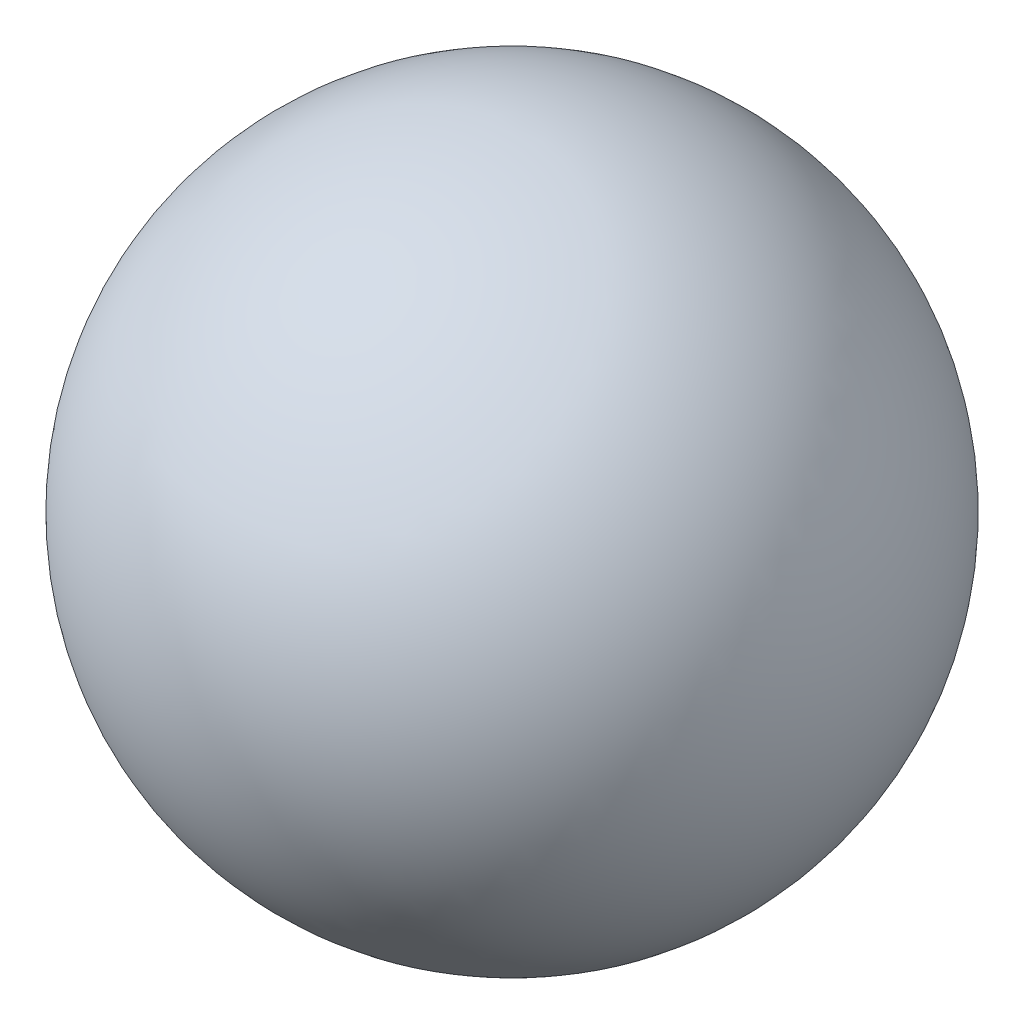
ISO-10303-21;
HEADER;
FILE_DESCRIPTION(('STEP AP214'),'2;1');
FILE_NAME('part.step','',(''),(''),'','','');
FILE_SCHEMA(('AUTOMOTIVE_DESIGN { 1 0 10303 214 1 1 1 1 }'));
ENDSEC;
DATA;
#1=APPLICATION_CONTEXT('core data for automotive mechanical design processes');
#2=APPLICATION_PROTOCOL_DEFINITION('international standard','automotive_design',2000,#1);
#3=PRODUCT_CONTEXT('',#1,'mechanical');
#4=PRODUCT('Part','Part','',(#3));
#5=PRODUCT_RELATED_PRODUCT_CATEGORY('part','',(#4));
#6=PRODUCT_DEFINITION_FORMATION('','',#4);
#7=PRODUCT_DEFINITION_CONTEXT('part definition',#1,'design');
#8=PRODUCT_DEFINITION('design','',#6,#7);
#9=PRODUCT_DEFINITION_SHAPE('','',#8);
#10=(LENGTH_UNIT() NAMED_UNIT(*) SI_UNIT(.MILLI.,.METRE.));
#11=(NAMED_UNIT(*) PLANE_ANGLE_UNIT() SI_UNIT($,.RADIAN.));
#12=(NAMED_UNIT(*) SI_UNIT($,.STERADIAN.) SOLID_ANGLE_UNIT());
#13=UNCERTAINTY_MEASURE_WITH_UNIT(LENGTH_MEASURE(1.E-05),#10,'distance_accuracy_value','');
#14=(GEOMETRIC_REPRESENTATION_CONTEXT(3) GLOBAL_UNCERTAINTY_ASSIGNED_CONTEXT((#13)) GLOBAL_UNIT_ASSIGNED_CONTEXT((#10,
#11,#12)) REPRESENTATION_CONTEXT('',''));
#15=CARTESIAN_POINT('',(0.,0.,0.));
#16=DIRECTION('',(0.,0.,1.));
#17=DIRECTION('',(1.,0.,0.));
#18=AXIS2_PLACEMENT_3D('',#15,#16,#17);
#19=CARTESIAN_POINT('',(0.,0.,0.));
#20=DIRECTION('',(0.,1.,0.));
#21=DIRECTION('',(1.,0.,0.));
#22=AXIS2_PLACEMENT_3D('',#19,#20,#21);
#23=SPHERICAL_SURFACE('',#22,45.);
#24=CARTESIAN_POINT('',(0.,45.,0.));
#25=VERTEX_POINT('',#24);
#26=VERTEX_LOOP('',#25);
#27=FACE_BOUND('',#26,.T.);
#28=ADVANCED_FACE('F29',(#27),#23,.T.);
#29=CLOSED_SHELL('',(#28));
#30=CARTESIAN_POINT('',(0.,0.,0.));
#31=DIRECTION('',(0.,1.,0.));
#32=DIRECTION('',(-1.,0.,0.));
#33=AXIS2_PLACEMENT_3D('',#30,#31,#32);
#34=SPHERICAL_SURFACE('',#33,42.);
#35=CARTESIAN_POINT('',(0.,42.,0.));
#36=VERTEX_POINT('',#35);
#37=VERTEX_LOOP('',#36);
#38=FACE_BOUND('',#37,.T.);
#39=ADVANCED_FACE('F42',(#38),#34,.F.);
#40=CLOSED_SHELL('',(#39));
#41=ORIENTED_CLOSED_SHELL('',*,#40,.T.);
#42=BREP_WITH_VOIDS('B2',#29,(#41));
#43=ADVANCED_BREP_SHAPE_REPRESENTATION('',(#18,#42),#14);
#44=SHAPE_DEFINITION_REPRESENTATION(#9,#43);
ENDSEC;
END-ISO-10303-21;
